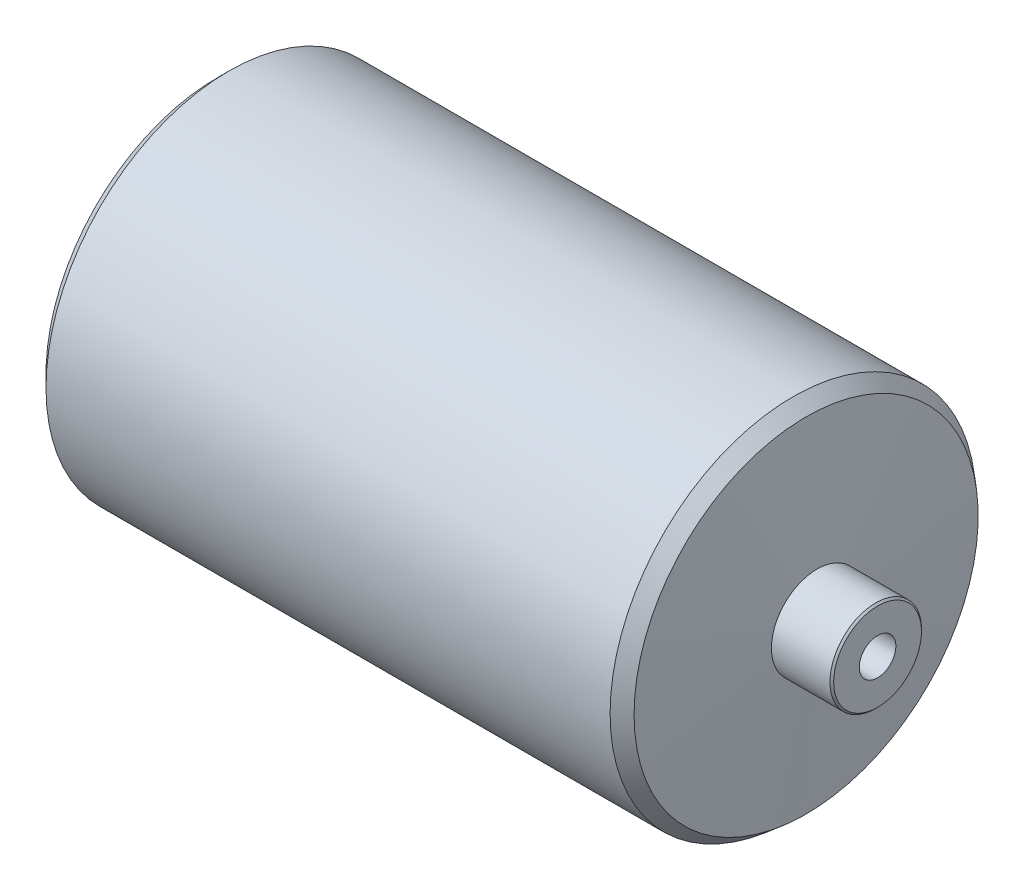
ISO-10303-21;
HEADER;
FILE_DESCRIPTION(('STEP AP214'),'2;1');
FILE_NAME('part.step','',(''),(''),'','','');
FILE_SCHEMA(('AUTOMOTIVE_DESIGN { 1 0 10303 214 1 1 1 1 }'));
ENDSEC;
DATA;
#1=APPLICATION_CONTEXT('core data for automotive mechanical design processes');
#2=APPLICATION_PROTOCOL_DEFINITION('international standard','automotive_design',2000,#1);
#3=PRODUCT_CONTEXT('',#1,'mechanical');
#4=PRODUCT('Part','Part','',(#3));
#5=PRODUCT_RELATED_PRODUCT_CATEGORY('part','',(#4));
#6=PRODUCT_DEFINITION_FORMATION('','',#4);
#7=PRODUCT_DEFINITION_CONTEXT('part definition',#1,'design');
#8=PRODUCT_DEFINITION('design','',#6,#7);
#9=PRODUCT_DEFINITION_SHAPE('','',#8);
#10=(LENGTH_UNIT() NAMED_UNIT(*) SI_UNIT(.MILLI.,.METRE.));
#11=(NAMED_UNIT(*) PLANE_ANGLE_UNIT() SI_UNIT($,.RADIAN.));
#12=(NAMED_UNIT(*) SI_UNIT($,.STERADIAN.) SOLID_ANGLE_UNIT());
#13=UNCERTAINTY_MEASURE_WITH_UNIT(LENGTH_MEASURE(1.E-05),#10,'distance_accuracy_value','');
#14=(GEOMETRIC_REPRESENTATION_CONTEXT(3) GLOBAL_UNCERTAINTY_ASSIGNED_CONTEXT((#13)) GLOBAL_UNIT_ASSIGNED_CONTEXT((#10,
#11,#12)) REPRESENTATION_CONTEXT('',''));
#15=CARTESIAN_POINT('',(0.,0.,0.));
#16=DIRECTION('',(0.,0.,1.));
#17=DIRECTION('',(1.,0.,0.));
#18=AXIS2_PLACEMENT_3D('',#15,#16,#17);
#19=CARTESIAN_POINT('',(26.6369423932657,0.,0.));
#20=DIRECTION('',(-1.,0.,0.));
#21=DIRECTION('',(0.,0.,1.));
#22=AXIS2_PLACEMENT_3D('',#19,#20,#21);
#23=CYLINDRICAL_SURFACE('',#22,12.5);
#24=CARTESIAN_POINT('',(98.5,0.,0.));
#25=DIRECTION('',(1.,0.,0.));
#26=DIRECTION('',(0.,0.,-1.));
#27=AXIS2_PLACEMENT_3D('',#24,#25,#26);
#28=CIRCLE('',#27,12.5);
#29=CARTESIAN_POINT('',(98.5,0.,-12.5));
#30=VERTEX_POINT('',#29);
#31=EDGE_CURVE('E10',#30,#30,#28,.T.);
#32=ORIENTED_EDGE('',*,*,#31,.T.);
#33=EDGE_LOOP('',(#32));
#34=FACE_BOUND('',#33,.T.);
#35=CARTESIAN_POINT('',(114.5,0.,0.));
#36=DIRECTION('',(-1.,0.,0.));
#37=DIRECTION('',(0.,0.,1.));
#38=AXIS2_PLACEMENT_3D('',#35,#36,#37);
#39=CIRCLE('',#38,12.5);
#40=CARTESIAN_POINT('',(114.5,0.,-12.5000000000001));
#41=VERTEX_POINT('',#40);
#42=EDGE_CURVE('E80',#41,#41,#39,.T.);
#43=ORIENTED_EDGE('',*,*,#42,.T.);
#44=EDGE_LOOP('',(#43));
#45=FACE_BOUND('',#44,.T.);
#46=ADVANCED_FACE('F33',(#34,#45),#23,.T.);
#47=CARTESIAN_POINT('',(98.,0.,0.));
#48=DIRECTION('',(1.,0.,0.));
#49=DIRECTION('',(0.,0.,-1.));
#50=AXIS2_PLACEMENT_3D('',#47,#48,#49);
#51=PLANE('',#50);
#52=CARTESIAN_POINT('',(98.,0.,0.));
#53=DIRECTION('',(1.,0.,0.));
#54=DIRECTION('',(0.,0.,-1.));
#55=AXIS2_PLACEMENT_3D('',#52,#53,#54);
#56=CIRCLE('',#55,12.);
#57=CARTESIAN_POINT('',(98.,0.,-12.));
#58=VERTEX_POINT('',#57);
#59=EDGE_CURVE('E40',#58,#58,#56,.F.);
#60=ORIENTED_EDGE('',*,*,#59,.T.);
#61=EDGE_LOOP('',(#60));
#62=FACE_BOUND('',#61,.T.);
#63=CARTESIAN_POINT('',(98.,0.,0.));
#64=DIRECTION('',(-1.,0.,0.));
#65=DIRECTION('',(0.,0.,1.));
#66=AXIS2_PLACEMENT_3D('',#63,#64,#65);
#67=CIRCLE('',#66,5.00000000000003);
#68=CARTESIAN_POINT('',(98.,0.,5.00000000000003));
#69=VERTEX_POINT('',#68);
#70=EDGE_CURVE('E65',#69,#69,#67,.T.);
#71=ORIENTED_EDGE('',*,*,#70,.F.);
#72=EDGE_LOOP('',(#71));
#73=FACE_BOUND('',#72,.T.);
#74=ADVANCED_FACE('F102',(#62,#73),#51,.F.);
#75=CARTESIAN_POINT('',(26.6369423932657,0.,0.));
#76=DIRECTION('',(-1.,0.,0.));
#77=DIRECTION('',(0.,0.,1.));
#78=AXIS2_PLACEMENT_3D('',#75,#76,#77);
#79=CYLINDRICAL_SURFACE('',#78,5.00000000000004);
#80=CARTESIAN_POINT('',(157.,0.,0.));
#81=DIRECTION('',(-1.,0.,0.));
#82=DIRECTION('',(0.,0.,1.));
#83=AXIS2_PLACEMENT_3D('',#80,#81,#82);
#84=CIRCLE('',#83,5.00000000000005);
#85=CARTESIAN_POINT('',(157.,0.,5.00000000000005));
#86=VERTEX_POINT('',#85);
#87=EDGE_CURVE('E68',#86,#86,#84,.T.);
#88=ORIENTED_EDGE('',*,*,#87,.F.);
#89=EDGE_LOOP('',(#88));
#90=FACE_BOUND('',#89,.T.);
#91=ORIENTED_EDGE('',*,*,#70,.T.);
#92=EDGE_LOOP('',(#91));
#93=FACE_BOUND('',#92,.T.);
#94=ADVANCED_FACE('F107',(#90,#93),#79,.F.);
#95=CARTESIAN_POINT('',(157.,0.,0.));
#96=DIRECTION('',(1.,0.,0.));
#97=DIRECTION('',(0.,0.,-1.));
#98=AXIS2_PLACEMENT_3D('',#95,#96,#97);
#99=PLANE('',#98);
#100=ORIENTED_EDGE('',*,*,#87,.T.);
#101=EDGE_LOOP('',(#100));
#102=FACE_BOUND('',#101,.T.);
#103=ADVANCED_FACE('F147',(#102),#99,.F.);
#104=CARTESIAN_POINT('',(239.,0.,0.));
#105=DIRECTION('',(-1.,0.,0.));
#106=DIRECTION('',(0.,0.,1.));
#107=AXIS2_PLACEMENT_3D('',#104,#105,#106);
#108=PLANE('',#107);
#109=CARTESIAN_POINT('',(239.,0.,0.));
#110=DIRECTION('',(-1.,0.,0.));
#111=DIRECTION('',(0.,0.,1.));
#112=AXIS2_PLACEMENT_3D('',#109,#110,#111);
#113=CIRCLE('',#112,5.00000000000007);
#114=CARTESIAN_POINT('',(239.,0.,5.00000000000007));
#115=VERTEX_POINT('',#114);
#116=EDGE_CURVE('E71',#115,#115,#113,.T.);
#117=ORIENTED_EDGE('',*,*,#116,.F.);
#118=EDGE_LOOP('',(#117));
#119=FACE_BOUND('',#118,.T.);
#120=ADVANCED_FACE('F143',(#119),#108,.F.);
#121=CARTESIAN_POINT('',(26.6369423932657,0.,0.));
#122=DIRECTION('',(-1.,0.,0.));
#123=DIRECTION('',(0.,0.,1.));
#124=AXIS2_PLACEMENT_3D('',#121,#122,#123);
#125=CYLINDRICAL_SURFACE('',#124,5.00000000000008);
#126=CARTESIAN_POINT('',(298.,0.,0.));
#127=DIRECTION('',(-1.,0.,0.));
#128=DIRECTION('',(0.,0.,1.));
#129=AXIS2_PLACEMENT_3D('',#126,#127,#128);
#130=CIRCLE('',#129,5.00000000000009);
#131=CARTESIAN_POINT('',(298.,0.,5.00000000000009));
#132=VERTEX_POINT('',#131);
#133=EDGE_CURVE('E74',#132,#132,#130,.T.);
#134=ORIENTED_EDGE('',*,*,#133,.F.);
#135=EDGE_LOOP('',(#134));
#136=FACE_BOUND('',#135,.T.);
#137=ORIENTED_EDGE('',*,*,#116,.T.);
#138=EDGE_LOOP('',(#137));
#139=FACE_BOUND('',#138,.T.);
#140=ADVANCED_FACE('F139',(#136,#139),#125,.F.);
#141=CARTESIAN_POINT('',(298.,0.,0.));
#142=DIRECTION('',(-1.,0.,0.));
#143=DIRECTION('',(0.,0.,1.));
#144=AXIS2_PLACEMENT_3D('',#141,#142,#143);
#145=PLANE('',#144);
#146=CARTESIAN_POINT('',(298.,0.,0.));
#147=DIRECTION('',(-1.,0.,0.));
#148=DIRECTION('',(0.,0.,1.));
#149=AXIS2_PLACEMENT_3D('',#146,#147,#148);
#150=CIRCLE('',#149,12.0000000000001);
#151=CARTESIAN_POINT('',(298.,0.,12.0000000000001));
#152=VERTEX_POINT('',#151);
#153=EDGE_CURVE('E44',#152,#152,#150,.F.);
#154=ORIENTED_EDGE('',*,*,#153,.T.);
#155=EDGE_LOOP('',(#154));
#156=FACE_BOUND('',#155,.T.);
#157=ORIENTED_EDGE('',*,*,#133,.T.);
#158=EDGE_LOOP('',(#157));
#159=FACE_BOUND('',#158,.T.);
#160=ADVANCED_FACE('F127',(#156,#159),#145,.F.);
#161=CARTESIAN_POINT('',(26.6369423932657,0.,0.));
#162=DIRECTION('',(-1.,0.,0.));
#163=DIRECTION('',(0.,0.,1.));
#164=AXIS2_PLACEMENT_3D('',#161,#162,#163);
#165=CYLINDRICAL_SURFACE('',#164,12.5000000000001);
#166=CARTESIAN_POINT('',(297.5,0.,0.));
#167=DIRECTION('',(-1.,0.,0.));
#168=DIRECTION('',(0.,0.,1.));
#169=AXIS2_PLACEMENT_3D('',#166,#167,#168);
#170=CIRCLE('',#169,12.5000000000001);
#171=CARTESIAN_POINT('',(297.5,0.,12.5000000000001));
#172=VERTEX_POINT('',#171);
#173=EDGE_CURVE('E48',#172,#172,#170,.T.);
#174=ORIENTED_EDGE('',*,*,#173,.T.);
#175=EDGE_LOOP('',(#174));
#176=FACE_BOUND('',#175,.T.);
#177=CARTESIAN_POINT('',(281.5,0.,0.));
#178=DIRECTION('',(-1.,0.,0.));
#179=DIRECTION('',(0.,0.,1.));
#180=AXIS2_PLACEMENT_3D('',#177,#178,#179);
#181=CIRCLE('',#180,12.5000000000001);
#182=CARTESIAN_POINT('',(281.5,0.,12.4999999999998));
#183=VERTEX_POINT('',#182);
#184=EDGE_CURVE('E77',#183,#183,#181,.T.);
#185=ORIENTED_EDGE('',*,*,#184,.F.);
#186=EDGE_LOOP('',(#185));
#187=FACE_BOUND('',#186,.T.);
#188=ADVANCED_FACE('F124',(#176,#187),#165,.T.);
#189=CARTESIAN_POINT('',(281.5,0.,0.));
#190=DIRECTION('',(-1.,0.,0.));
#191=DIRECTION('',(0.,0.,1.));
#192=AXIS2_PLACEMENT_3D('',#189,#190,#191);
#193=CONICAL_SURFACE('',#192,12.5000000000001,1.48352986419518);
#194=CARTESIAN_POINT('',(278.480642346021,0.,0.));
#195=DIRECTION('',(1.,0.,0.));
#196=DIRECTION('',(0.,0.,-1.));
#197=AXIS2_PLACEMENT_3D('',#194,#195,#196);
#198=CIRCLE('',#197,47.0114159057247);
#199=CARTESIAN_POINT('',(278.480642346021,0.,47.0114159057248));
#200=VERTEX_POINT('',#199);
#201=EDGE_CURVE('E53',#200,#200,#198,.T.);
#202=CARTESIAN_POINT('',(278.480642346021,0.,47.0114159057248));
#203=CARTESIAN_POINT('',(278.51209398825,0.,46.6519219900401));
#204=CARTESIAN_POINT('',(278.543545630479,0.,46.2924280743555));
#205=CARTESIAN_POINT('',(278.606448914937,0.,45.5734402429862));
#206=CARTESIAN_POINT('',(278.637900557166,0.,45.2139463273016));
#207=CARTESIAN_POINT('',(278.700803841623,0.,44.4949584959323));
#208=CARTESIAN_POINT('',(278.732255483852,0.,44.1354645802477));
#209=CARTESIAN_POINT('',(278.79515876831,0.,43.4164767488784));
#210=CARTESIAN_POINT('',(278.826610410539,0.,43.0569828331938));
#211=CARTESIAN_POINT('',(278.889513694997,0.,42.3379950018245));
#212=CARTESIAN_POINT('',(278.920965337226,0.,41.9785010861399));
#213=CARTESIAN_POINT('',(278.983868621684,0.,41.2595132547706));
#214=CARTESIAN_POINT('',(279.015320263913,0.,40.900019339086));
#215=CARTESIAN_POINT('',(279.078223548371,0.,40.1810315077167));
#216=CARTESIAN_POINT('',(279.1096751906,0.,39.8215375920321));
#217=CARTESIAN_POINT('',(279.172578475058,0.,39.1025497606628));
#218=CARTESIAN_POINT('',(279.204030117287,0.,38.7430558449782));
#219=CARTESIAN_POINT('',(279.266933401745,0.,38.0240680136089));
#220=CARTESIAN_POINT('',(279.298385043974,0.,37.6645740979242));
#221=CARTESIAN_POINT('',(279.361288328431,0.,36.945586266555));
#222=CARTESIAN_POINT('',(279.39273997066,0.,36.5860923508703));
#223=CARTESIAN_POINT('',(279.455643255118,0.,35.8671045195011));
#224=CARTESIAN_POINT('',(279.487094897347,0.,35.5076106038164));
#225=CARTESIAN_POINT('',(279.549998181805,0.,34.7886227724472));
#226=CARTESIAN_POINT('',(279.581449824034,0.,34.4291288567625));
#227=CARTESIAN_POINT('',(279.644353108492,0.,33.7101410253933));
#228=CARTESIAN_POINT('',(279.675804750721,0.,33.3506471097086));
#229=CARTESIAN_POINT('',(279.738708035179,0.,32.6316592783393));
#230=CARTESIAN_POINT('',(279.770159677408,0.,32.2721653626547));
#231=CARTESIAN_POINT('',(279.833062961866,0.,31.5531775312854));
#232=CARTESIAN_POINT('',(279.864514604095,0.,31.1936836156008));
#233=CARTESIAN_POINT('',(279.927417888552,0.,30.4746957842315));
#234=CARTESIAN_POINT('',(279.958869530781,0.,30.1152018685469));
#235=CARTESIAN_POINT('',(280.021772815239,0.,29.3962140371776));
#236=CARTESIAN_POINT('',(280.053224457468,0.,29.036720121493));
#237=CARTESIAN_POINT('',(280.116127741926,0.,28.3177322901237));
#238=CARTESIAN_POINT('',(280.147579384155,0.,27.9582383744391));
#239=CARTESIAN_POINT('',(280.210482668613,0.,27.2392505430698));
#240=CARTESIAN_POINT('',(280.241934310842,0.,26.8797566273852));
#241=CARTESIAN_POINT('',(280.3048375953,0.,26.1607687960159));
#242=CARTESIAN_POINT('',(280.336289237529,0.,25.8012748803313));
#243=CARTESIAN_POINT('',(280.399192521987,0.,25.082287048962));
#244=CARTESIAN_POINT('',(280.430644164216,0.,24.7227931332774));
#245=CARTESIAN_POINT('',(280.493547448674,0.,24.0038053019081));
#246=CARTESIAN_POINT('',(280.524999090903,0.,23.6443113862235));
#247=CARTESIAN_POINT('',(280.58790237536,0.,22.9253235548542));
#248=CARTESIAN_POINT('',(280.619354017589,0.,22.5658296391696));
#249=CARTESIAN_POINT('',(280.682257302047,0.,21.8468418078003));
#250=CARTESIAN_POINT('',(280.713708944276,0.,21.4873478921157));
#251=CARTESIAN_POINT('',(280.776612228734,0.,20.7683600607464));
#252=CARTESIAN_POINT('',(280.808063870963,0.,20.4088661450617));
#253=CARTESIAN_POINT('',(280.870967155421,0.,19.6898783136925));
#254=CARTESIAN_POINT('',(280.90241879765,0.,19.3303843980078));
#255=CARTESIAN_POINT('',(280.965322082108,0.,18.6113965666386));
#256=CARTESIAN_POINT('',(280.996773724337,0.,18.2519026509539));
#257=CARTESIAN_POINT('',(281.059677008795,0.,17.5329148195847));
#258=CARTESIAN_POINT('',(281.091128651024,0.,17.1734209039));
#259=CARTESIAN_POINT('',(281.154031935482,0.,16.4544330725308));
#260=CARTESIAN_POINT('',(281.18548357771,0.,16.0949391568461));
#261=CARTESIAN_POINT('',(281.248386862168,0.,15.3759513254768));
#262=CARTESIAN_POINT('',(281.279838504397,0.,15.0164574097922));
#263=CARTESIAN_POINT('',(281.342741788855,0.,14.2974695784229));
#264=CARTESIAN_POINT('',(281.374193431084,0.,13.9379756627383));
#265=CARTESIAN_POINT('',(281.437096715542,0.,13.218987831369));
#266=CARTESIAN_POINT('',(281.468548357771,0.,12.8594939156844));
#267=CARTESIAN_POINT('',(281.5,0.,12.4999999999998));
#268=B_SPLINE_CURVE_WITH_KNOTS('',3,(#202,#203,#204,#205,#206,#207,#208,#209,#210,#211,#212,
#213,#214,#215,#216,#217,#218,#219,#220,#221,#222,#223,#224,#225,#226,#227,#228,#229,#230,#231,
#232,#233,#234,#235,#236,#237,#238,#239,#240,#241,#242,#243,#244,#245,#246,#247,#248,#249,#250,
#251,#252,#253,#254,#255,#256,#257,#258,#259,#260,#261,#262,#263,#264,#265,#266,#267),
.UNSPECIFIED.,.F.,.F.,(4,2,2,2,2,2,2,2,2,2,2,2,2,2,2,2,2,2,2,2,2,2,2,2,2,2,2,2,2,2,2,2,4),(0.,
1.08260137212111,2.16520274424223,3.24780411636335,4.33040548848447,5.41300686060559,
6.49560823272671,7.57820960484782,8.66081097696894,9.74341234909006,10.8260137212112,
11.9086150933323,12.9912164654534,14.0738178375745,15.1564192096956,16.2390205818168,
17.3216219539379,18.404223326059,19.4868246981801,20.5694260703012,21.6520274424224,
22.7346288145435,23.8172301866646,24.8998315587857,25.9824329309068,27.065034303028,
28.1476356751491,29.2302370472702,30.3128384193913,31.3954397915124,32.4780411636335,
33.5606425357547,34.6432439078758),.UNSPECIFIED.);
#269=EDGE_CURVE('BSEAM98',#200,#183,#268,.T.);
#270=ORIENTED_EDGE('',*,*,#201,.T.);
#271=ORIENTED_EDGE('',*,*,#184,.T.);
#272=ORIENTED_EDGE('',*,*,#269,.T.);
#273=ORIENTED_EDGE('',*,*,#269,.F.);
#274=EDGE_LOOP('',(#270,#272,#271,#273));
#275=FACE_BOUND('',#274,.T.);
#276=ADVANCED_FACE('F98',(#275),#193,.T.);
#277=CARTESIAN_POINT('',(26.6369423932657,0.,0.));
#278=DIRECTION('',(-1.,0.,0.));
#279=DIRECTION('',(0.,0.,1.));
#280=AXIS2_PLACEMENT_3D('',#277,#278,#279);
#281=CYLINDRICAL_SURFACE('',#280,50.);
#282=CARTESIAN_POINT('',(120.780824882222,0.,0.));
#283=DIRECTION('',(1.,0.,0.));
#284=DIRECTION('',(0.,0.,-1.));
#285=AXIS2_PLACEMENT_3D('',#282,#283,#284);
#286=CIRCLE('',#285,50.);
#287=CARTESIAN_POINT('',(120.780824882222,0.,-50.));
#288=VERTEX_POINT('',#287);
#289=EDGE_CURVE('E56',#288,#288,#286,.T.);
#290=ORIENTED_EDGE('',*,*,#289,.T.);
#291=EDGE_LOOP('',(#290));
#292=FACE_BOUND('',#291,.T.);
#293=CARTESIAN_POINT('',(274.918986514899,0.,0.));
#294=DIRECTION('',(-1.,0.,0.));
#295=DIRECTION('',(0.,0.,1.));
#296=AXIS2_PLACEMENT_3D('',#293,#294,#295);
#297=CIRCLE('',#296,50.);
#298=CARTESIAN_POINT('',(274.918986514899,0.,50.));
#299=VERTEX_POINT('',#298);
#300=EDGE_CURVE('E59',#299,#299,#297,.T.);
#301=ORIENTED_EDGE('',*,*,#300,.T.);
#302=EDGE_LOOP('',(#301));
#303=FACE_BOUND('',#302,.T.);
#304=ADVANCED_FACE('F88',(#292,#303),#281,.T.);
#305=CARTESIAN_POINT('',(117.780824882222,0.,0.));
#306=DIRECTION('',(1.,0.,0.));
#307=DIRECTION('',(0.,0.,-1.));
#308=AXIS2_PLACEMENT_3D('',#305,#306,#307);
#309=CONICAL_SURFACE('',#308,50.,1.48352986419518);
#310=CARTESIAN_POINT('',(117.493194493331,0.,0.));
#311=DIRECTION('',(-1.,0.,0.));
#312=DIRECTION('',(0.,0.,1.));
#313=AXIS2_PLACEMENT_3D('',#310,#311,#312);
#314=CIRCLE('',#313,46.7123696111087);
#315=CARTESIAN_POINT('',(117.493194493331,0.,-46.7123696111087));
#316=VERTEX_POINT('',#315);
#317=EDGE_CURVE('E62',#316,#316,#314,.T.);
#318=CARTESIAN_POINT('',(117.493194493331,0.,-46.7123696111087));
#319=CARTESIAN_POINT('',(117.462015384025,0.,-46.355990760993));
#320=CARTESIAN_POINT('',(117.43083627472,0.,-45.9996119108773));
#321=CARTESIAN_POINT('',(117.368478056109,0.,-45.2868542106459));
#322=CARTESIAN_POINT('',(117.337298946803,0.,-44.9304753605301));
#323=CARTESIAN_POINT('',(117.274940728192,0.,-44.2177176602987));
#324=CARTESIAN_POINT('',(117.243761618886,0.,-43.861338810183));
#325=CARTESIAN_POINT('',(117.181403400275,0.,-43.1485811099516));
#326=CARTESIAN_POINT('',(117.15022429097,0.,-42.7922022598359));
#327=CARTESIAN_POINT('',(117.087866072359,0.,-42.0794445596044));
#328=CARTESIAN_POINT('',(117.056686963053,0.,-41.7230657094887));
#329=CARTESIAN_POINT('',(116.994328744442,0.,-41.0103080092573));
#330=CARTESIAN_POINT('',(116.963149635137,0.,-40.6539291591416));
#331=CARTESIAN_POINT('',(116.900791416526,0.,-39.9411714589101));
#332=CARTESIAN_POINT('',(116.86961230722,0.,-39.5847926087944));
#333=CARTESIAN_POINT('',(116.807254088609,0.,-38.872034908563));
#334=CARTESIAN_POINT('',(116.776074979304,0.,-38.5156560584473));
#335=CARTESIAN_POINT('',(116.713716760692,0.,-37.8028983582159));
#336=CARTESIAN_POINT('',(116.682537651387,0.,-37.4465195081001));
#337=CARTESIAN_POINT('',(116.620179432776,0.,-36.7337618078687));
#338=CARTESIAN_POINT('',(116.58900032347,0.,-36.377382957753));
#339=CARTESIAN_POINT('',(116.526642104859,0.,-35.6646252575216));
#340=CARTESIAN_POINT('',(116.495462995554,0.,-35.3082464074059));
#341=CARTESIAN_POINT('',(116.433104776943,0.,-34.5954887071744));
#342=CARTESIAN_POINT('',(116.401925667637,0.,-34.2391098570587));
#343=CARTESIAN_POINT('',(116.339567449026,0.,-33.5263521568273));
#344=CARTESIAN_POINT('',(116.308388339721,0.,-33.1699733067116));
#345=CARTESIAN_POINT('',(116.24603012111,0.,-32.4572156064801));
#346=CARTESIAN_POINT('',(116.214851011804,0.,-32.1008367563644));
#347=CARTESIAN_POINT('',(116.152492793193,0.,-31.388079056133));
#348=CARTESIAN_POINT('',(116.121313683887,0.,-31.0317002060173));
#349=CARTESIAN_POINT('',(116.058955465276,0.,-30.3189425057859));
#350=CARTESIAN_POINT('',(116.027776355971,0.,-29.9625636556701));
#351=CARTESIAN_POINT('',(115.96541813736,0.,-29.2498059554387));
#352=CARTESIAN_POINT('',(115.934239028054,0.,-28.893427105323));
#353=CARTESIAN_POINT('',(115.871880809443,0.,-28.1806694050916));
#354=CARTESIAN_POINT('',(115.840701700138,0.,-27.8242905549759));
#355=CARTESIAN_POINT('',(115.778343481527,0.,-27.1115328547444));
#356=CARTESIAN_POINT('',(115.747164372221,0.,-26.7551540046287));
#357=CARTESIAN_POINT('',(115.68480615361,0.,-26.0423963043973));
#358=CARTESIAN_POINT('',(115.653627044305,0.,-25.6860174542816));
#359=CARTESIAN_POINT('',(115.591268825693,0.,-24.9732597540501));
#360=CARTESIAN_POINT('',(115.560089716388,0.,-24.6168809039344));
#361=CARTESIAN_POINT('',(115.497731497777,0.,-23.904123203703));
#362=CARTESIAN_POINT('',(115.466552388471,0.,-23.5477443535873));
#363=CARTESIAN_POINT('',(115.40419416986,0.,-22.8349866533559));
#364=CARTESIAN_POINT('',(115.373015060555,0.,-22.4786078032401));
#365=CARTESIAN_POINT('',(115.310656841944,0.,-21.7658501030087));
#366=CARTESIAN_POINT('',(115.279477732638,0.,-21.409471252893));
#367=CARTESIAN_POINT('',(115.217119514027,0.,-20.6967135526616));
#368=CARTESIAN_POINT('',(115.185940404722,0.,-20.3403347025459));
#369=CARTESIAN_POINT('',(115.123582186111,0.,-19.6275770023144));
#370=CARTESIAN_POINT('',(115.092403076805,0.,-19.2711981521987));
#371=CARTESIAN_POINT('',(115.030044858194,0.,-18.5584404519673));
#372=CARTESIAN_POINT('',(114.998865748888,0.,-18.2020616018516));
#373=CARTESIAN_POINT('',(114.936507530277,0.,-17.4893039016201));
#374=CARTESIAN_POINT('',(114.905328420972,0.,-17.1329250515044));
#375=CARTESIAN_POINT('',(114.842970202361,0.,-16.420167351273));
#376=CARTESIAN_POINT('',(114.811791093055,0.,-16.0637885011573));
#377=CARTESIAN_POINT('',(114.749432874444,0.,-15.3510308009259));
#378=CARTESIAN_POINT('',(114.718253765139,0.,-14.9946519508101));
#379=CARTESIAN_POINT('',(114.655895546528,0.,-14.2818942505787));
#380=CARTESIAN_POINT('',(114.624716437222,0.,-13.925515400463));
#381=CARTESIAN_POINT('',(114.562358218611,0.,-13.2127577002316));
#382=CARTESIAN_POINT('',(114.531179109305,0.,-12.8563788501159));
#383=CARTESIAN_POINT('',(114.5,0.,-12.5000000000001));
#384=B_SPLINE_CURVE_WITH_KNOTS('',3,(#318,#319,#320,#321,#322,#323,#324,#325,#326,#327,#328,
#329,#330,#331,#332,#333,#334,#335,#336,#337,#338,#339,#340,#341,#342,#343,#344,#345,#346,#347,
#348,#349,#350,#351,#352,#353,#354,#355,#356,#357,#358,#359,#360,#361,#362,#363,#364,#365,#366,
#367,#368,#369,#370,#371,#372,#373,#374,#375,#376,#377,#378,#379,#380,#381,#382,#383),
.UNSPECIFIED.,.F.,.F.,(4,2,2,2,2,2,2,2,2,2,2,2,2,2,2,2,2,2,2,2,2,2,2,2,2,2,2,2,2,2,2,2,4),(0.,
1.07322047828113,2.14644095656225,3.21966143484337,4.29288191312449,5.36610239140562,
6.43932286968674,7.51254334796787,8.58576382624899,9.65898430453012,10.7322047828112,
11.8054252610924,12.8786457393735,13.9518662176546,15.0250866959357,16.0983071742169,
17.171527652498,18.2447481307791,19.3179686090602,20.3911890873413,21.4644095656225,
22.5376300439036,23.6108505221847,24.6840710004658,25.757291478747,26.8305119570281,
27.9037324353092,28.9769529135903,30.0501733918715,31.1233938701526,32.1966143484337,
33.2698348267148,34.343055304996),.UNSPECIFIED.);
#385=EDGE_CURVE('BSEAM85',#316,#41,#384,.T.);
#386=ORIENTED_EDGE('',*,*,#317,.T.);
#387=ORIENTED_EDGE('',*,*,#42,.F.);
#388=ORIENTED_EDGE('',*,*,#385,.T.);
#389=ORIENTED_EDGE('',*,*,#385,.F.);
#390=EDGE_LOOP('',(#386,#388,#387,#389));
#391=FACE_BOUND('',#390,.T.);
#392=ADVANCED_FACE('F85',(#391),#309,.T.);
#393=CARTESIAN_POINT('',(117.493194493331,0.,0.));
#394=DIRECTION('',(1.,0.,0.));
#395=DIRECTION('',(0.,0.,-1.));
#396=AXIS2_PLACEMENT_3D('',#393,#394,#395);
#397=CONICAL_SURFACE('',#396,46.7123696111087,0.785398163397447);
#398=ORIENTED_EDGE('',*,*,#289,.F.);
#399=EDGE_LOOP('',(#398));
#400=FACE_BOUND('',#399,.T.);
#401=ORIENTED_EDGE('',*,*,#317,.F.);
#402=EDGE_LOOP('',(#401));
#403=FACE_BOUND('',#402,.T.);
#404=ADVANCED_FACE('F87',(#400,#403),#397,.T.);
#405=CARTESIAN_POINT('',(274.918986514899,0.,0.));
#406=DIRECTION('',(-1.,0.,0.));
#407=DIRECTION('',(0.,0.,1.));
#408=AXIS2_PLACEMENT_3D('',#405,#406,#407);
#409=CONICAL_SURFACE('',#408,50.,0.69813170079775);
#410=ORIENTED_EDGE('',*,*,#201,.F.);
#411=EDGE_LOOP('',(#410));
#412=FACE_BOUND('',#411,.T.);
#413=ORIENTED_EDGE('',*,*,#300,.F.);
#414=EDGE_LOOP('',(#413));
#415=FACE_BOUND('',#414,.T.);
#416=ADVANCED_FACE('F95',(#412,#415),#409,.T.);
#417=CARTESIAN_POINT('',(297.5,0.,0.));
#418=DIRECTION('',(-1.,0.,0.));
#419=DIRECTION('',(0.,0.,1.));
#420=AXIS2_PLACEMENT_3D('',#417,#418,#419);
#421=CONICAL_SURFACE('',#420,12.5000000000001,0.785398163397464);
#422=ORIENTED_EDGE('',*,*,#153,.F.);
#423=EDGE_LOOP('',(#422));
#424=FACE_BOUND('',#423,.T.);
#425=ORIENTED_EDGE('',*,*,#173,.F.);
#426=EDGE_LOOP('',(#425));
#427=FACE_BOUND('',#426,.T.);
#428=ADVANCED_FACE('F112',(#424,#427),#421,.T.);
#429=CARTESIAN_POINT('',(98.,0.,0.));
#430=DIRECTION('',(1.,0.,0.));
#431=DIRECTION('',(0.,0.,-1.));
#432=AXIS2_PLACEMENT_3D('',#429,#430,#431);
#433=CONICAL_SURFACE('',#432,12.,0.785398163397459);
#434=ORIENTED_EDGE('',*,*,#31,.F.);
#435=EDGE_LOOP('',(#434));
#436=FACE_BOUND('',#435,.T.);
#437=ORIENTED_EDGE('',*,*,#59,.F.);
#438=EDGE_LOOP('',(#437));
#439=FACE_BOUND('',#438,.T.);
#440=ADVANCED_FACE('F35',(#436,#439),#433,.T.);
#441=CLOSED_SHELL('',(#46,#74,#94,#103,#120,#140,#160,#188,#276,#304,#392,#404,#416,#428,#440));
#442=MANIFOLD_SOLID_BREP('B2',#441);
#443=ADVANCED_BREP_SHAPE_REPRESENTATION('',(#18,#442),#14);
#444=SHAPE_DEFINITION_REPRESENTATION(#9,#443);
ENDSEC;
END-ISO-10303-21;
